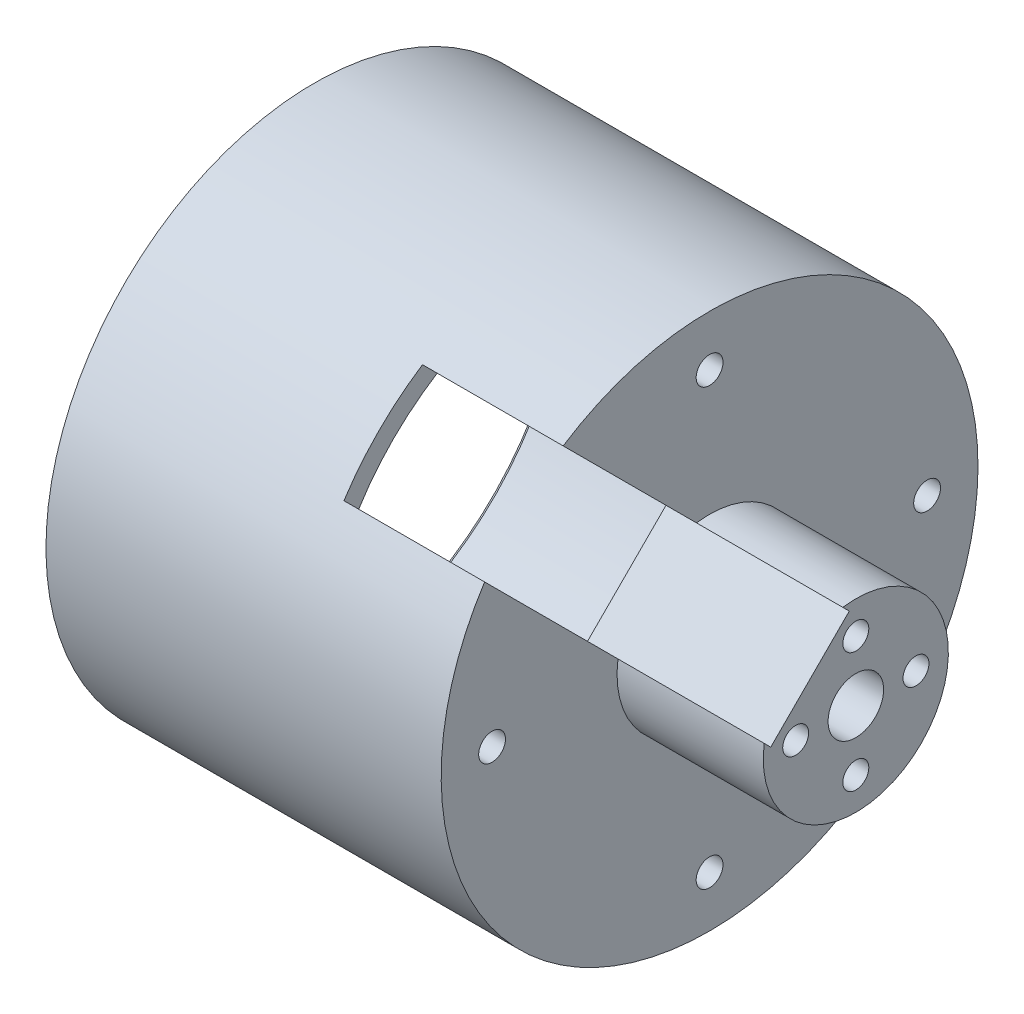
ISO-10303-21;
HEADER;
FILE_DESCRIPTION(('STEP AP214'),'2;1');
FILE_NAME('part.step','',(''),(''),'','','');
FILE_SCHEMA(('AUTOMOTIVE_DESIGN { 1 0 10303 214 1 1 1 1 }'));
ENDSEC;
DATA;
#1=APPLICATION_CONTEXT('core data for automotive mechanical design processes');
#2=APPLICATION_PROTOCOL_DEFINITION('international standard','automotive_design',2000,#1);
#3=PRODUCT_CONTEXT('',#1,'mechanical');
#4=PRODUCT('Part','Part','',(#3));
#5=PRODUCT_RELATED_PRODUCT_CATEGORY('part','',(#4));
#6=PRODUCT_DEFINITION_FORMATION('','',#4);
#7=PRODUCT_DEFINITION_CONTEXT('part definition',#1,'design');
#8=PRODUCT_DEFINITION('design','',#6,#7);
#9=PRODUCT_DEFINITION_SHAPE('','',#8);
#10=(LENGTH_UNIT() NAMED_UNIT(*) SI_UNIT(.MILLI.,.METRE.));
#11=(NAMED_UNIT(*) PLANE_ANGLE_UNIT() SI_UNIT($,.RADIAN.));
#12=(NAMED_UNIT(*) SI_UNIT($,.STERADIAN.) SOLID_ANGLE_UNIT());
#13=UNCERTAINTY_MEASURE_WITH_UNIT(LENGTH_MEASURE(1.E-05),#10,'distance_accuracy_value','');
#14=(GEOMETRIC_REPRESENTATION_CONTEXT(3) GLOBAL_UNCERTAINTY_ASSIGNED_CONTEXT((#13)) GLOBAL_UNIT_ASSIGNED_CONTEXT((#10,
#11,#12)) REPRESENTATION_CONTEXT('',''));
#15=CARTESIAN_POINT('',(0.,0.,0.));
#16=DIRECTION('',(0.,0.,1.));
#17=DIRECTION('',(1.,0.,0.));
#18=AXIS2_PLACEMENT_3D('',#15,#16,#17);
#19=CARTESIAN_POINT('',(21.2,0.,0.));
#20=DIRECTION('',(-1.,0.,0.));
#21=DIRECTION('',(0.,0.,1.));
#22=AXIS2_PLACEMENT_3D('',#19,#20,#21);
#23=CYLINDRICAL_SURFACE('',#22,29.);
#24=CARTESIAN_POINT('',(-21.5,0.,0.));
#25=DIRECTION('',(1.,0.,0.));
#26=DIRECTION('',(0.,0.,-1.));
#27=AXIS2_PLACEMENT_3D('',#24,#25,#26);
#28=CIRCLE('',#27,29.);
#29=CARTESIAN_POINT('',(-21.5,0.,-29.));
#30=VERTEX_POINT('',#29);
#31=EDGE_CURVE('E216',#30,#30,#28,.T.);
#32=ORIENTED_EDGE('',*,*,#31,.T.);
#33=EDGE_LOOP('',(#32));
#34=FACE_BOUND('',#33,.T.);
#35=DIRECTION('',(-1.,0.,0.));
#36=VECTOR('',#35,1.);
#37=CARTESIAN_POINT('',(21.2,15.8197619606196,24.3050433348582));
#38=LINE('',#37,#36);
#39=CARTESIAN_POINT('',(6.,15.8197619606196,24.3050433348582));
#40=VERTEX_POINT('',#39);
#41=CARTESIAN_POINT('',(21.2,15.8197619606196,24.3050433348582));
#42=VERTEX_POINT('',#41);
#43=EDGE_CURVE('E182',#40,#42,#38,.F.);
#44=ORIENTED_EDGE('',*,*,#43,.F.);
#45=CARTESIAN_POINT('',(6.,0.,0.));
#46=DIRECTION('',(1.,0.,0.));
#47=DIRECTION('',(0.,0.,-1.));
#48=AXIS2_PLACEMENT_3D('',#45,#46,#47);
#49=CIRCLE('',#48,29.);
#50=CARTESIAN_POINT('',(6.,24.3050433348582,15.8197619606196));
#51=VERTEX_POINT('',#50);
#52=EDGE_CURVE('E189',#51,#40,#49,.T.);
#53=ORIENTED_EDGE('',*,*,#52,.F.);
#54=DIRECTION('',(-1.,0.,0.));
#55=VECTOR('',#54,1.);
#56=CARTESIAN_POINT('',(21.2,24.3050433348582,15.8197619606196));
#57=LINE('',#56,#55);
#58=CARTESIAN_POINT('',(21.2,24.3050433348582,15.8197619606196));
#59=VERTEX_POINT('',#58);
#60=EDGE_CURVE('E171',#59,#51,#57,.T.);
#61=ORIENTED_EDGE('',*,*,#60,.F.);
#62=CARTESIAN_POINT('',(21.2,0.,0.));
#63=DIRECTION('',(1.,0.,0.));
#64=DIRECTION('',(0.,0.,-1.));
#65=AXIS2_PLACEMENT_3D('',#62,#63,#64);
#66=CIRCLE('',#65,29.);
#67=EDGE_CURVE('E110',#42,#59,#66,.T.);
#68=ORIENTED_EDGE('',*,*,#67,.F.);
#69=EDGE_LOOP('',(#44,#53,#61,#68));
#70=FACE_BOUND('',#69,.T.);
#71=ADVANCED_FACE('F41',(#34,#70),#23,.T.);
#72=CARTESIAN_POINT('',(21.2,0.,0.));
#73=DIRECTION('',(1.,0.,0.));
#74=DIRECTION('',(0.,0.,-1.));
#75=AXIS2_PLACEMENT_3D('',#72,#73,#74);
#76=PLANE('',#75);
#77=CARTESIAN_POINT('',(21.2,0.,-23.5));
#78=DIRECTION('',(1.,0.,0.));
#79=DIRECTION('',(0.,0.,-1.));
#80=AXIS2_PLACEMENT_3D('',#77,#78,#79);
#81=CIRCLE('',#80,1.45);
#82=CARTESIAN_POINT('',(21.2,0.,-24.95));
#83=VERTEX_POINT('',#82);
#84=EDGE_CURVE('E192',#83,#83,#81,.F.);
#85=ORIENTED_EDGE('',*,*,#84,.T.);
#86=EDGE_LOOP('',(#85));
#87=FACE_BOUND('',#86,.T.);
#88=CARTESIAN_POINT('',(21.2,-23.5,0.));
#89=DIRECTION('',(1.,0.,0.));
#90=DIRECTION('',(0.,0.,-1.));
#91=AXIS2_PLACEMENT_3D('',#88,#89,#90);
#92=CIRCLE('',#91,1.45);
#93=CARTESIAN_POINT('',(21.2,-23.5,-1.45));
#94=VERTEX_POINT('',#93);
#95=EDGE_CURVE('E196',#94,#94,#92,.F.);
#96=ORIENTED_EDGE('',*,*,#95,.T.);
#97=EDGE_LOOP('',(#96));
#98=FACE_BOUND('',#97,.T.);
#99=CARTESIAN_POINT('',(21.2,0.,23.5));
#100=DIRECTION('',(1.,0.,0.));
#101=DIRECTION('',(0.,0.,-1.));
#102=AXIS2_PLACEMENT_3D('',#99,#100,#101);
#103=CIRCLE('',#102,1.45);
#104=CARTESIAN_POINT('',(21.2,0.,22.05));
#105=VERTEX_POINT('',#104);
#106=EDGE_CURVE('E200',#105,#105,#103,.F.);
#107=ORIENTED_EDGE('',*,*,#106,.T.);
#108=EDGE_LOOP('',(#107));
#109=FACE_BOUND('',#108,.T.);
#110=CARTESIAN_POINT('',(21.2,23.5,0.));
#111=DIRECTION('',(1.,0.,0.));
#112=DIRECTION('',(0.,0.,-1.));
#113=AXIS2_PLACEMENT_3D('',#110,#111,#112);
#114=CIRCLE('',#113,1.45);
#115=CARTESIAN_POINT('',(21.2,23.5,-1.45));
#116=VERTEX_POINT('',#115);
#117=EDGE_CURVE('E204',#116,#116,#114,.F.);
#118=ORIENTED_EDGE('',*,*,#117,.T.);
#119=EDGE_LOOP('',(#118));
#120=FACE_BOUND('',#119,.T.);
#121=CARTESIAN_POINT('',(21.2,0.,0.));
#122=DIRECTION('',(1.,0.,0.));
#123=DIRECTION('',(0.,0.,-1.));
#124=AXIS2_PLACEMENT_3D('',#121,#122,#123);
#125=CIRCLE('',#124,10.);
#126=CARTESIAN_POINT('',(21.2,9.89949493661167,1.41421356237309));
#127=VERTEX_POINT('',#126);
#128=CARTESIAN_POINT('',(21.2,1.41421356237309,9.89949493661166));
#129=VERTEX_POINT('',#128);
#130=EDGE_CURVE('E212',#127,#129,#125,.F.);
#131=ORIENTED_EDGE('',*,*,#130,.T.);
#132=DIRECTION('',(0.,0.707106781186548,0.707106781186547));
#133=VECTOR('',#132,1.);
#134=CARTESIAN_POINT('',(21.2,-4.24264068711928,4.24264068711929));
#135=LINE('',#134,#133);
#136=EDGE_CURVE('E179',#129,#42,#135,.T.);
#137=ORIENTED_EDGE('',*,*,#136,.T.);
#138=ORIENTED_EDGE('',*,*,#67,.T.);
#139=DIRECTION('',(0.,-0.707106781186548,-0.707106781186547));
#140=VECTOR('',#139,1.);
#141=CARTESIAN_POINT('',(21.2,4.24264068711929,-4.24264068711929));
#142=LINE('',#141,#140);
#143=EDGE_CURVE('E168',#59,#127,#142,.T.);
#144=ORIENTED_EDGE('',*,*,#143,.T.);
#145=EDGE_LOOP('',(#131,#137,#138,#144));
#146=FACE_BOUND('',#145,.T.);
#147=ADVANCED_FACE('F257',(#87,#98,#109,#120,#146),#76,.T.);
#148=CARTESIAN_POINT('',(17.2,0.,0.));
#149=DIRECTION('',(-1.,0.,0.));
#150=DIRECTION('',(0.,0.,1.));
#151=AXIS2_PLACEMENT_3D('',#148,#149,#150);
#152=CYLINDRICAL_SURFACE('',#151,26.8);
#153=CARTESIAN_POINT('',(-21.,0.,0.));
#154=DIRECTION('',(1.,0.,0.));
#155=DIRECTION('',(0.,1.,0.));
#156=AXIS2_PLACEMENT_3D('',#153,#154,#155);
#157=CIRCLE('',#156,26.8);
#158=CARTESIAN_POINT('',(-21.,26.8,0.));
#159=VERTEX_POINT('',#158);
#160=EDGE_CURVE('E151',#159,#159,#157,.T.);
#161=ORIENTED_EDGE('',*,*,#160,.F.);
#162=EDGE_LOOP('',(#161));
#163=FACE_BOUND('',#162,.T.);
#164=CARTESIAN_POINT('',(6.,0.,0.));
#165=DIRECTION('',(1.,0.,0.));
#166=DIRECTION('',(0.,0.,-1.));
#167=AXIS2_PLACEMENT_3D('',#164,#165,#166);
#168=CIRCLE('',#167,26.8);
#169=CARTESIAN_POINT('',(6.,22.7120748961036,14.226793521865));
#170=VERTEX_POINT('',#169);
#171=CARTESIAN_POINT('',(6.,14.226793521865,22.7120748961036));
#172=VERTEX_POINT('',#171);
#173=EDGE_CURVE('E11',#170,#172,#168,.T.);
#174=ORIENTED_EDGE('',*,*,#173,.T.);
#175=DIRECTION('',(-1.,0.,0.));
#176=VECTOR('',#175,1.);
#177=CARTESIAN_POINT('',(17.2,14.226793521865,22.7120748961036));
#178=LINE('',#177,#176);
#179=CARTESIAN_POINT('',(17.2,14.226793521865,22.7120748961036));
#180=VERTEX_POINT('',#179);
#181=EDGE_CURVE('E186',#172,#180,#178,.F.);
#182=ORIENTED_EDGE('',*,*,#181,.T.);
#183=CARTESIAN_POINT('',(17.2,0.,0.));
#184=DIRECTION('',(1.,0.,0.));
#185=DIRECTION('',(0.,0.,-1.));
#186=AXIS2_PLACEMENT_3D('',#183,#184,#185);
#187=CIRCLE('',#186,26.8);
#188=CARTESIAN_POINT('',(17.2,22.7120748961036,14.226793521865));
#189=VERTEX_POINT('',#188);
#190=EDGE_CURVE('E213',#180,#189,#187,.T.);
#191=ORIENTED_EDGE('',*,*,#190,.T.);
#192=DIRECTION('',(-1.,0.,0.));
#193=VECTOR('',#192,1.);
#194=CARTESIAN_POINT('',(17.2,22.7120748961036,14.226793521865));
#195=LINE('',#194,#193);
#196=EDGE_CURVE('E174',#189,#170,#195,.T.);
#197=ORIENTED_EDGE('',*,*,#196,.T.);
#198=EDGE_LOOP('',(#174,#182,#191,#197));
#199=FACE_BOUND('',#198,.T.);
#200=ADVANCED_FACE('F239',(#163,#199),#152,.F.);
#201=CARTESIAN_POINT('',(17.2,0.,0.));
#202=DIRECTION('',(1.,0.,0.));
#203=DIRECTION('',(0.,0.,-1.));
#204=AXIS2_PLACEMENT_3D('',#201,#202,#203);
#205=PLANE('',#204);
#206=CARTESIAN_POINT('',(17.2,0.,0.));
#207=DIRECTION('',(1.,0.,0.));
#208=DIRECTION('',(0.,0.,-1.));
#209=AXIS2_PLACEMENT_3D('',#206,#207,#208);
#210=CIRCLE('',#209,3.);
#211=CARTESIAN_POINT('',(17.2,0.,-3.));
#212=VERTEX_POINT('',#211);
#213=EDGE_CURVE('E208',#212,#212,#210,.F.);
#214=ORIENTED_EDGE('',*,*,#213,.F.);
#215=EDGE_LOOP('',(#214));
#216=FACE_BOUND('',#215,.T.);
#217=CARTESIAN_POINT('',(17.2,23.5,0.));
#218=DIRECTION('',(1.,0.,0.));
#219=DIRECTION('',(0.,0.,-1.));
#220=AXIS2_PLACEMENT_3D('',#217,#218,#219);
#221=CIRCLE('',#220,1.45);
#222=CARTESIAN_POINT('',(17.2,23.5,-1.45));
#223=VERTEX_POINT('',#222);
#224=EDGE_CURVE('E203',#223,#223,#221,.F.);
#225=ORIENTED_EDGE('',*,*,#224,.F.);
#226=EDGE_LOOP('',(#225));
#227=FACE_BOUND('',#226,.T.);
#228=CARTESIAN_POINT('',(17.2,0.,23.5));
#229=DIRECTION('',(1.,0.,0.));
#230=DIRECTION('',(0.,0.,-1.));
#231=AXIS2_PLACEMENT_3D('',#228,#229,#230);
#232=CIRCLE('',#231,1.45);
#233=CARTESIAN_POINT('',(17.2,0.,22.05));
#234=VERTEX_POINT('',#233);
#235=EDGE_CURVE('E199',#234,#234,#232,.F.);
#236=ORIENTED_EDGE('',*,*,#235,.F.);
#237=EDGE_LOOP('',(#236));
#238=FACE_BOUND('',#237,.T.);
#239=CARTESIAN_POINT('',(17.2,-23.5,0.));
#240=DIRECTION('',(1.,0.,0.));
#241=DIRECTION('',(0.,0.,-1.));
#242=AXIS2_PLACEMENT_3D('',#239,#240,#241);
#243=CIRCLE('',#242,1.45);
#244=CARTESIAN_POINT('',(17.2,-23.5,-1.45));
#245=VERTEX_POINT('',#244);
#246=EDGE_CURVE('E195',#245,#245,#243,.F.);
#247=ORIENTED_EDGE('',*,*,#246,.F.);
#248=EDGE_LOOP('',(#247));
#249=FACE_BOUND('',#248,.T.);
#250=CARTESIAN_POINT('',(17.2,0.,-23.5));
#251=DIRECTION('',(1.,0.,0.));
#252=DIRECTION('',(0.,0.,-1.));
#253=AXIS2_PLACEMENT_3D('',#250,#251,#252);
#254=CIRCLE('',#253,1.45);
#255=CARTESIAN_POINT('',(17.2,0.,-24.95));
#256=VERTEX_POINT('',#255);
#257=EDGE_CURVE('E191',#256,#256,#254,.F.);
#258=ORIENTED_EDGE('',*,*,#257,.F.);
#259=EDGE_LOOP('',(#258));
#260=FACE_BOUND('',#259,.T.);
#261=DIRECTION('',(0.,0.707106781186548,0.707106781186547));
#262=VECTOR('',#261,1.);
#263=CARTESIAN_POINT('',(17.2,-4.24264068711928,4.24264068711929));
#264=LINE('',#263,#262);
#265=CARTESIAN_POINT('',(17.2,0.707106781186548,9.19238815542512));
#266=VERTEX_POINT('',#265);
#267=EDGE_CURVE('E184',#266,#180,#264,.T.);
#268=ORIENTED_EDGE('',*,*,#267,.F.);
#269=DIRECTION('',(0.,-0.707106781186547,0.707106781186548));
#270=VECTOR('',#269,1.);
#271=CARTESIAN_POINT('',(17.2,4.94974746830583,4.94974746830583));
#272=LINE('',#271,#270);
#273=CARTESIAN_POINT('',(17.2,9.19238815542512,0.707106781186548));
#274=VERTEX_POINT('',#273);
#275=EDGE_CURVE('E164',#274,#266,#272,.T.);
#276=ORIENTED_EDGE('',*,*,#275,.F.);
#277=DIRECTION('',(0.,-0.707106781186548,-0.707106781186547));
#278=VECTOR('',#277,1.);
#279=CARTESIAN_POINT('',(17.2,4.24264068711929,-4.24264068711929));
#280=LINE('',#279,#278);
#281=EDGE_CURVE('E116',#189,#274,#280,.T.);
#282=ORIENTED_EDGE('',*,*,#281,.F.);
#283=ORIENTED_EDGE('',*,*,#190,.F.);
#284=EDGE_LOOP('',(#268,#276,#282,#283));
#285=FACE_BOUND('',#284,.T.);
#286=ADVANCED_FACE('F235',(#216,#227,#238,#249,#260,#285),#205,.F.);
#287=CARTESIAN_POINT('',(37.,0.,0.));
#288=DIRECTION('',(-1.,0.,0.));
#289=DIRECTION('',(0.,0.,1.));
#290=AXIS2_PLACEMENT_3D('',#287,#288,#289);
#291=CYLINDRICAL_SURFACE('',#290,10.);
#292=DIRECTION('',(-1.,0.,0.));
#293=VECTOR('',#292,1.);
#294=CARTESIAN_POINT('',(37.,1.41421356237309,9.89949493661167));
#295=LINE('',#294,#293);
#296=CARTESIAN_POINT('',(37.,1.41421356237309,9.89949493661167));
#297=VERTEX_POINT('',#296);
#298=EDGE_CURVE('E177',#129,#297,#295,.F.);
#299=ORIENTED_EDGE('',*,*,#298,.F.);
#300=ORIENTED_EDGE('',*,*,#130,.F.);
#301=DIRECTION('',(-1.,0.,0.));
#302=VECTOR('',#301,1.);
#303=CARTESIAN_POINT('',(37.,9.89949493661167,1.4142135623731));
#304=LINE('',#303,#302);
#305=CARTESIAN_POINT('',(37.,9.89949493661167,1.41421356237309));
#306=VERTEX_POINT('',#305);
#307=EDGE_CURVE('E166',#306,#127,#304,.T.);
#308=ORIENTED_EDGE('',*,*,#307,.F.);
#309=CARTESIAN_POINT('',(37.,0.,0.));
#310=DIRECTION('',(1.,0.,0.));
#311=DIRECTION('',(0.,0.,-1.));
#312=AXIS2_PLACEMENT_3D('',#309,#310,#311);
#313=CIRCLE('',#312,10.);
#314=EDGE_CURVE('E123',#297,#306,#313,.T.);
#315=ORIENTED_EDGE('',*,*,#314,.F.);
#316=EDGE_LOOP('',(#299,#300,#308,#315));
#317=FACE_BOUND('',#316,.T.);
#318=ADVANCED_FACE('F238',(#317),#291,.T.);
#319=CARTESIAN_POINT('',(37.,0.,0.));
#320=DIRECTION('',(1.,0.,0.));
#321=DIRECTION('',(0.,0.,-1.));
#322=AXIS2_PLACEMENT_3D('',#319,#320,#321);
#323=PLANE('',#322);
#324=CARTESIAN_POINT('',(37.,0.,-6.5));
#325=DIRECTION('',(1.,0.,0.));
#326=DIRECTION('',(0.,0.,-1.));
#327=AXIS2_PLACEMENT_3D('',#324,#325,#326);
#328=CIRCLE('',#327,1.4);
#329=CARTESIAN_POINT('',(37.,0.,-5.1));
#330=VERTEX_POINT('',#329);
#331=EDGE_CURVE('E139',#330,#330,#328,.F.);
#332=ORIENTED_EDGE('',*,*,#331,.T.);
#333=EDGE_LOOP('',(#332));
#334=FACE_BOUND('',#333,.T.);
#335=CARTESIAN_POINT('',(37.,-6.5,0.));
#336=DIRECTION('',(1.,0.,0.));
#337=DIRECTION('',(0.,0.,-1.));
#338=AXIS2_PLACEMENT_3D('',#335,#336,#337);
#339=CIRCLE('',#338,1.4);
#340=CARTESIAN_POINT('',(37.,-6.5,1.4));
#341=VERTEX_POINT('',#340);
#342=EDGE_CURVE('E136',#341,#341,#339,.F.);
#343=ORIENTED_EDGE('',*,*,#342,.T.);
#344=EDGE_LOOP('',(#343));
#345=FACE_BOUND('',#344,.T.);
#346=CARTESIAN_POINT('',(37.,0.,6.5));
#347=DIRECTION('',(1.,0.,0.));
#348=DIRECTION('',(0.,0.,-1.));
#349=AXIS2_PLACEMENT_3D('',#346,#347,#348);
#350=CIRCLE('',#349,1.4);
#351=CARTESIAN_POINT('',(37.,0.,7.9));
#352=VERTEX_POINT('',#351);
#353=EDGE_CURVE('E132',#352,#352,#350,.F.);
#354=ORIENTED_EDGE('',*,*,#353,.T.);
#355=EDGE_LOOP('',(#354));
#356=FACE_BOUND('',#355,.T.);
#357=CARTESIAN_POINT('',(37.,6.50000000000001,0.));
#358=DIRECTION('',(1.,0.,0.));
#359=DIRECTION('',(0.,0.,-1.));
#360=AXIS2_PLACEMENT_3D('',#357,#358,#359);
#361=CIRCLE('',#360,1.4);
#362=CARTESIAN_POINT('',(37.,6.50000000000001,1.4));
#363=VERTEX_POINT('',#362);
#364=EDGE_CURVE('E128',#363,#363,#361,.F.);
#365=ORIENTED_EDGE('',*,*,#364,.T.);
#366=EDGE_LOOP('',(#365));
#367=FACE_BOUND('',#366,.T.);
#368=CARTESIAN_POINT('',(37.,0.,0.));
#369=DIRECTION('',(1.,0.,0.));
#370=DIRECTION('',(0.,0.,-1.));
#371=AXIS2_PLACEMENT_3D('',#368,#369,#370);
#372=CIRCLE('',#371,3.);
#373=CARTESIAN_POINT('',(37.,0.,-3.));
#374=VERTEX_POINT('',#373);
#375=EDGE_CURVE('E207',#374,#374,#372,.F.);
#376=ORIENTED_EDGE('',*,*,#375,.T.);
#377=EDGE_LOOP('',(#376));
#378=FACE_BOUND('',#377,.T.);
#379=DIRECTION('',(0.,-0.707106781186547,0.707106781186548));
#380=VECTOR('',#379,1.);
#381=CARTESIAN_POINT('',(37.,4.94974746830583,4.94974746830583));
#382=LINE('',#381,#380);
#383=CARTESIAN_POINT('',(37.,9.19238815542512,0.707106781186547));
#384=VERTEX_POINT('',#383);
#385=CARTESIAN_POINT('',(37.,0.707106781186548,9.19238815542512));
#386=VERTEX_POINT('',#385);
#387=EDGE_CURVE('E104',#384,#386,#382,.T.);
#388=ORIENTED_EDGE('',*,*,#387,.T.);
#389=DIRECTION('',(0.,0.707106781186548,0.707106781186547));
#390=VECTOR('',#389,1.);
#391=CARTESIAN_POINT('',(37.,-4.24264068711929,4.24264068711929));
#392=LINE('',#391,#390);
#393=EDGE_CURVE('E49',#386,#297,#392,.T.);
#394=ORIENTED_EDGE('',*,*,#393,.T.);
#395=ORIENTED_EDGE('',*,*,#314,.T.);
#396=DIRECTION('',(0.,-0.707106781186548,-0.707106781186547));
#397=VECTOR('',#396,1.);
#398=CARTESIAN_POINT('',(37.,4.24264068711929,-4.24264068711929));
#399=LINE('',#398,#397);
#400=EDGE_CURVE('E109',#306,#384,#399,.T.);
#401=ORIENTED_EDGE('',*,*,#400,.T.);
#402=EDGE_LOOP('',(#388,#394,#395,#401));
#403=FACE_BOUND('',#402,.T.);
#404=ADVANCED_FACE('F121',(#334,#345,#356,#367,#378,#403),#323,.T.);
#405=CARTESIAN_POINT('',(-21.5,0.,0.));
#406=DIRECTION('',(1.,0.,0.));
#407=DIRECTION('',(0.,0.,-1.));
#408=AXIS2_PLACEMENT_3D('',#405,#406,#407);
#409=PLANE('',#408);
#410=CARTESIAN_POINT('',(-21.5,0.,0.));
#411=DIRECTION('',(1.,0.,0.));
#412=DIRECTION('',(0.,0.,-1.));
#413=AXIS2_PLACEMENT_3D('',#410,#411,#412);
#414=CIRCLE('',#413,27.2901960784314);
#415=CARTESIAN_POINT('',(-21.5,0.,-27.2901960784314));
#416=VERTEX_POINT('',#415);
#417=EDGE_CURVE('E44',#416,#416,#414,.T.);
#418=ORIENTED_EDGE('',*,*,#417,.T.);
#419=EDGE_LOOP('',(#418));
#420=FACE_BOUND('',#419,.T.);
#421=ORIENTED_EDGE('',*,*,#31,.F.);
#422=EDGE_LOOP('',(#421));
#423=FACE_BOUND('',#422,.T.);
#424=ADVANCED_FACE('F266',(#420,#423),#409,.F.);
#425=CARTESIAN_POINT('',(38.,0.,0.));
#426=DIRECTION('',(-1.,0.,0.));
#427=DIRECTION('',(0.,0.,1.));
#428=AXIS2_PLACEMENT_3D('',#425,#426,#427);
#429=CYLINDRICAL_SURFACE('',#428,3.);
#430=ORIENTED_EDGE('',*,*,#375,.F.);
#431=EDGE_LOOP('',(#430));
#432=FACE_BOUND('',#431,.T.);
#433=ORIENTED_EDGE('',*,*,#213,.T.);
#434=EDGE_LOOP('',(#433));
#435=FACE_BOUND('',#434,.T.);
#436=ADVANCED_FACE('F278',(#432,#435),#429,.F.);
#437=CARTESIAN_POINT('',(21.3,23.5,0.));
#438=DIRECTION('',(-1.,0.,0.));
#439=DIRECTION('',(0.,0.,1.));
#440=AXIS2_PLACEMENT_3D('',#437,#438,#439);
#441=CYLINDRICAL_SURFACE('',#440,1.45);
#442=ORIENTED_EDGE('',*,*,#117,.F.);
#443=EDGE_LOOP('',(#442));
#444=FACE_BOUND('',#443,.T.);
#445=ORIENTED_EDGE('',*,*,#224,.T.);
#446=EDGE_LOOP('',(#445));
#447=FACE_BOUND('',#446,.T.);
#448=ADVANCED_FACE('F283',(#444,#447),#441,.F.);
#449=CARTESIAN_POINT('',(21.3,0.,23.5));
#450=DIRECTION('',(-1.,0.,0.));
#451=DIRECTION('',(0.,0.,1.));
#452=AXIS2_PLACEMENT_3D('',#449,#450,#451);
#453=CYLINDRICAL_SURFACE('',#452,1.45);
#454=ORIENTED_EDGE('',*,*,#106,.F.);
#455=EDGE_LOOP('',(#454));
#456=FACE_BOUND('',#455,.T.);
#457=ORIENTED_EDGE('',*,*,#235,.T.);
#458=EDGE_LOOP('',(#457));
#459=FACE_BOUND('',#458,.T.);
#460=ADVANCED_FACE('F347',(#456,#459),#453,.F.);
#461=CARTESIAN_POINT('',(21.3,-23.5,0.));
#462=DIRECTION('',(-1.,0.,0.));
#463=DIRECTION('',(0.,0.,1.));
#464=AXIS2_PLACEMENT_3D('',#461,#462,#463);
#465=CYLINDRICAL_SURFACE('',#464,1.45);
#466=ORIENTED_EDGE('',*,*,#95,.F.);
#467=EDGE_LOOP('',(#466));
#468=FACE_BOUND('',#467,.T.);
#469=ORIENTED_EDGE('',*,*,#246,.T.);
#470=EDGE_LOOP('',(#469));
#471=FACE_BOUND('',#470,.T.);
#472=ADVANCED_FACE('F343',(#468,#471),#465,.F.);
#473=CARTESIAN_POINT('',(21.3,0.,-23.5));
#474=DIRECTION('',(-1.,0.,0.));
#475=DIRECTION('',(0.,0.,1.));
#476=AXIS2_PLACEMENT_3D('',#473,#474,#475);
#477=CYLINDRICAL_SURFACE('',#476,1.45);
#478=ORIENTED_EDGE('',*,*,#84,.F.);
#479=EDGE_LOOP('',(#478));
#480=FACE_BOUND('',#479,.T.);
#481=ORIENTED_EDGE('',*,*,#257,.T.);
#482=EDGE_LOOP('',(#481));
#483=FACE_BOUND('',#482,.T.);
#484=ADVANCED_FACE('F233',(#480,#483),#477,.F.);
#485=CARTESIAN_POINT('',(6.,28.9913780286485,20.5060966544099));
#486=DIRECTION('',(1.,0.,0.));
#487=DIRECTION('',(0.,-0.707106781186548,-0.707106781186547));
#488=AXIS2_PLACEMENT_3D('',#485,#486,#487);
#489=PLANE('',#488);
#490=ORIENTED_EDGE('',*,*,#52,.T.);
#491=DIRECTION('',(0.,-0.707106781186548,-0.707106781186547));
#492=VECTOR('',#491,1.);
#493=CARTESIAN_POINT('',(6.,20.5060966544099,28.9913780286484));
#494=LINE('',#493,#492);
#495=EDGE_CURVE('E161',#40,#172,#494,.T.);
#496=ORIENTED_EDGE('',*,*,#495,.T.);
#497=ORIENTED_EDGE('',*,*,#173,.F.);
#498=DIRECTION('',(0.,-0.707106781186548,-0.707106781186547));
#499=VECTOR('',#498,1.);
#500=CARTESIAN_POINT('',(6.,28.9913780286485,20.5060966544099));
#501=LINE('',#500,#499);
#502=EDGE_CURVE('E118',#51,#170,#501,.T.);
#503=ORIENTED_EDGE('',*,*,#502,.F.);
#504=EDGE_LOOP('',(#490,#496,#497,#503));
#505=FACE_BOUND('',#504,.T.);
#506=ADVANCED_FACE('F250',(#505),#489,.T.);
#507=CARTESIAN_POINT('',(6.,20.5060966544099,28.9913780286484));
#508=DIRECTION('',(0.,0.707106781186547,-0.707106781186547));
#509=DIRECTION('',(0.,0.707106781186548,0.707106781186547));
#510=AXIS2_PLACEMENT_3D('',#507,#508,#509);
#511=PLANE('',#510);
#512=ORIENTED_EDGE('',*,*,#495,.F.);
#513=ORIENTED_EDGE('',*,*,#43,.T.);
#514=ORIENTED_EDGE('',*,*,#136,.F.);
#515=ORIENTED_EDGE('',*,*,#298,.T.);
#516=ORIENTED_EDGE('',*,*,#393,.F.);
#517=DIRECTION('',(1.,0.,0.));
#518=VECTOR('',#517,1.);
#519=CARTESIAN_POINT('',(6.,0.707106781186548,9.19238815542512));
#520=LINE('',#519,#518);
#521=EDGE_CURVE('E62',#266,#386,#520,.T.);
#522=ORIENTED_EDGE('',*,*,#521,.F.);
#523=ORIENTED_EDGE('',*,*,#267,.T.);
#524=ORIENTED_EDGE('',*,*,#181,.F.);
#525=EDGE_LOOP('',(#512,#513,#514,#515,#516,#522,#523,#524));
#526=FACE_BOUND('',#525,.T.);
#527=ADVANCED_FACE('F246',(#526),#511,.T.);
#528=CARTESIAN_POINT('',(37.1,28.9913780286485,20.5060966544099));
#529=DIRECTION('',(0.,-0.707106781186547,0.707106781186547));
#530=DIRECTION('',(0.,-0.707106781186548,-0.707106781186547));
#531=AXIS2_PLACEMENT_3D('',#528,#529,#530);
#532=PLANE('',#531);
#533=ORIENTED_EDGE('',*,*,#281,.T.);
#534=DIRECTION('',(-1.,0.,0.));
#535=VECTOR('',#534,1.);
#536=CARTESIAN_POINT('',(37.1,9.19238815542512,0.707106781186547));
#537=LINE('',#536,#535);
#538=EDGE_CURVE('E57',#384,#274,#537,.T.);
#539=ORIENTED_EDGE('',*,*,#538,.F.);
#540=ORIENTED_EDGE('',*,*,#400,.F.);
#541=ORIENTED_EDGE('',*,*,#307,.T.);
#542=ORIENTED_EDGE('',*,*,#143,.F.);
#543=ORIENTED_EDGE('',*,*,#60,.T.);
#544=ORIENTED_EDGE('',*,*,#502,.T.);
#545=ORIENTED_EDGE('',*,*,#196,.F.);
#546=EDGE_LOOP('',(#533,#539,#540,#541,#542,#543,#544,#545));
#547=FACE_BOUND('',#546,.T.);
#548=ADVANCED_FACE('F113',(#547),#532,.T.);
#549=CARTESIAN_POINT('',(6.,0.707106781186548,9.19238815542512));
#550=DIRECTION('',(0.,0.707106781186548,0.707106781186547));
#551=DIRECTION('',(1.,0.,0.));
#552=AXIS2_PLACEMENT_3D('',#549,#550,#551);
#553=PLANE('',#552);
#554=ORIENTED_EDGE('',*,*,#275,.T.);
#555=ORIENTED_EDGE('',*,*,#521,.T.);
#556=ORIENTED_EDGE('',*,*,#387,.F.);
#557=ORIENTED_EDGE('',*,*,#538,.T.);
#558=EDGE_LOOP('',(#554,#555,#556,#557));
#559=FACE_BOUND('',#558,.T.);
#560=ADVANCED_FACE('F105',(#559),#553,.T.);
#561=CARTESIAN_POINT('',(37.01,6.50000000000001,0.));
#562=DIRECTION('',(-1.,0.,0.));
#563=DIRECTION('',(0.,0.,1.));
#564=AXIS2_PLACEMENT_3D('',#561,#562,#563);
#565=CYLINDRICAL_SURFACE('',#564,1.4);
#566=CARTESIAN_POINT('',(24.99,6.50000000000001,0.));
#567=DIRECTION('',(1.,0.,0.));
#568=DIRECTION('',(0.,0.,-1.));
#569=AXIS2_PLACEMENT_3D('',#566,#567,#568);
#570=CIRCLE('',#569,1.4);
#571=CARTESIAN_POINT('',(24.99,6.50000000000001,1.4));
#572=VERTEX_POINT('',#571);
#573=EDGE_CURVE('E131',#572,#572,#570,.T.);
#574=CARTESIAN_POINT('',(37.,6.50000000000001,1.4));
#575=CARTESIAN_POINT('',(36.8748958333333,6.50000000000001,1.4));
#576=CARTESIAN_POINT('',(36.7497916666667,6.50000000000001,1.4));
#577=CARTESIAN_POINT('',(36.4995833333333,6.50000000000001,1.4));
#578=CARTESIAN_POINT('',(36.3744791666667,6.50000000000001,1.4));
#579=CARTESIAN_POINT('',(36.1242708333333,6.50000000000001,1.4));
#580=CARTESIAN_POINT('',(35.9991666666667,6.50000000000001,1.4));
#581=CARTESIAN_POINT('',(35.7489583333333,6.50000000000001,1.4));
#582=CARTESIAN_POINT('',(35.6238541666667,6.50000000000001,1.4));
#583=CARTESIAN_POINT('',(35.3736458333333,6.50000000000001,1.4));
#584=CARTESIAN_POINT('',(35.2485416666667,6.50000000000001,1.4));
#585=CARTESIAN_POINT('',(34.9983333333333,6.50000000000001,1.4));
#586=CARTESIAN_POINT('',(34.8732291666667,6.50000000000001,1.4));
#587=CARTESIAN_POINT('',(34.6230208333333,6.50000000000001,1.4));
#588=CARTESIAN_POINT('',(34.4979166666667,6.50000000000001,1.4));
#589=CARTESIAN_POINT('',(34.2477083333333,6.50000000000001,1.4));
#590=CARTESIAN_POINT('',(34.1226041666667,6.50000000000001,1.4));
#591=CARTESIAN_POINT('',(33.8723958333333,6.50000000000001,1.4));
#592=CARTESIAN_POINT('',(33.7472916666667,6.50000000000001,1.4));
#593=CARTESIAN_POINT('',(33.4970833333333,6.50000000000001,1.4));
#594=CARTESIAN_POINT('',(33.3719791666667,6.50000000000001,1.4));
#595=CARTESIAN_POINT('',(33.1217708333333,6.50000000000001,1.4));
#596=CARTESIAN_POINT('',(32.9966666666667,6.50000000000001,1.4));
#597=CARTESIAN_POINT('',(32.7464583333333,6.50000000000001,1.4));
#598=CARTESIAN_POINT('',(32.6213541666667,6.50000000000001,1.4));
#599=CARTESIAN_POINT('',(32.3711458333333,6.50000000000001,1.4));
#600=CARTESIAN_POINT('',(32.2460416666667,6.50000000000001,1.4));
#601=CARTESIAN_POINT('',(31.9958333333333,6.50000000000001,1.4));
#602=CARTESIAN_POINT('',(31.8707291666667,6.50000000000001,1.4));
#603=CARTESIAN_POINT('',(31.6205208333333,6.50000000000001,1.4));
#604=CARTESIAN_POINT('',(31.4954166666667,6.50000000000001,1.4));
#605=CARTESIAN_POINT('',(31.2452083333333,6.50000000000001,1.4));
#606=CARTESIAN_POINT('',(31.1201041666667,6.50000000000001,1.4));
#607=CARTESIAN_POINT('',(30.8698958333333,6.50000000000001,1.4));
#608=CARTESIAN_POINT('',(30.7447916666667,6.50000000000001,1.4));
#609=CARTESIAN_POINT('',(30.4945833333333,6.50000000000001,1.4));
#610=CARTESIAN_POINT('',(30.3694791666667,6.50000000000001,1.4));
#611=CARTESIAN_POINT('',(30.1192708333333,6.50000000000001,1.4));
#612=CARTESIAN_POINT('',(29.9941666666667,6.50000000000001,1.4));
#613=CARTESIAN_POINT('',(29.7439583333333,6.50000000000001,1.4));
#614=CARTESIAN_POINT('',(29.6188541666667,6.50000000000001,1.4));
#615=CARTESIAN_POINT('',(29.3686458333333,6.50000000000001,1.4));
#616=CARTESIAN_POINT('',(29.2435416666667,6.50000000000001,1.4));
#617=CARTESIAN_POINT('',(28.9933333333333,6.50000000000001,1.4));
#618=CARTESIAN_POINT('',(28.8682291666667,6.50000000000001,1.4));
#619=CARTESIAN_POINT('',(28.6180208333333,6.50000000000001,1.4));
#620=CARTESIAN_POINT('',(28.4929166666667,6.50000000000001,1.4));
#621=CARTESIAN_POINT('',(28.2427083333333,6.50000000000001,1.4));
#622=CARTESIAN_POINT('',(28.1176041666667,6.50000000000001,1.4));
#623=CARTESIAN_POINT('',(27.8673958333333,6.50000000000001,1.4));
#624=CARTESIAN_POINT('',(27.7422916666667,6.50000000000001,1.4));
#625=CARTESIAN_POINT('',(27.4920833333333,6.50000000000001,1.4));
#626=CARTESIAN_POINT('',(27.3669791666667,6.50000000000001,1.4));
#627=CARTESIAN_POINT('',(27.1167708333333,6.50000000000001,1.4));
#628=CARTESIAN_POINT('',(26.9916666666667,6.50000000000001,1.4));
#629=CARTESIAN_POINT('',(26.7414583333333,6.50000000000001,1.4));
#630=CARTESIAN_POINT('',(26.6163541666667,6.50000000000001,1.4));
#631=CARTESIAN_POINT('',(26.3661458333333,6.50000000000001,1.4));
#632=CARTESIAN_POINT('',(26.2410416666667,6.50000000000001,1.4));
#633=CARTESIAN_POINT('',(25.9908333333333,6.50000000000001,1.4));
#634=CARTESIAN_POINT('',(25.8657291666667,6.50000000000001,1.4));
#635=CARTESIAN_POINT('',(25.6155208333333,6.50000000000001,1.4));
#636=CARTESIAN_POINT('',(25.4904166666667,6.50000000000001,1.4));
#637=CARTESIAN_POINT('',(25.2402083333333,6.50000000000001,1.4));
#638=CARTESIAN_POINT('',(25.1151041666667,6.50000000000001,1.4));
#639=CARTESIAN_POINT('',(24.99,6.50000000000001,1.4));
#640=B_SPLINE_CURVE_WITH_KNOTS('',3,(#574,#575,#576,#577,#578,#579,#580,#581,#582,#583,#584,
#585,#586,#587,#588,#589,#590,#591,#592,#593,#594,#595,#596,#597,#598,#599,#600,#601,#602,#603,
#604,#605,#606,#607,#608,#609,#610,#611,#612,#613,#614,#615,#616,#617,#618,#619,#620,#621,#622,
#623,#624,#625,#626,#627,#628,#629,#630,#631,#632,#633,#634,#635,#636,#637,#638,#639),
.UNSPECIFIED.,.F.,.F.,(4,2,2,2,2,2,2,2,2,2,2,2,2,2,2,2,2,2,2,2,2,2,2,2,2,2,2,2,2,2,2,2,4),(0.,
0.375312499999995,0.750624999999998,1.1259375,1.50125,1.8765625,2.251875,2.6271875,3.0025,
3.3778125,3.753125,4.1284375,4.50375,4.8790625,5.254375,5.6296875,6.005,6.3803125,6.755625,
7.1309375,7.50625,7.8815625,8.256875,8.6321875,9.0075,9.3828125,9.758125,10.1334375,10.50875,
10.8840625,11.259375,11.6346875,12.01),.UNSPECIFIED.);
#641=EDGE_CURVE('BSEAM328',#363,#572,#640,.T.);
#642=ORIENTED_EDGE('',*,*,#364,.F.);
#643=ORIENTED_EDGE('',*,*,#573,.F.);
#644=ORIENTED_EDGE('',*,*,#641,.T.);
#645=ORIENTED_EDGE('',*,*,#641,.F.);
#646=EDGE_LOOP('',(#642,#644,#643,#645));
#647=FACE_BOUND('',#646,.T.);
#648=ADVANCED_FACE('F328',(#647),#565,.F.);
#649=CARTESIAN_POINT('',(24.99,6.50000000000001,0.));
#650=DIRECTION('',(1.,0.,0.));
#651=DIRECTION('',(0.,0.,-1.));
#652=AXIS2_PLACEMENT_3D('',#649,#650,#651);
#653=PLANE('',#652);
#654=ORIENTED_EDGE('',*,*,#573,.T.);
#655=EDGE_LOOP('',(#654));
#656=FACE_BOUND('',#655,.T.);
#657=ADVANCED_FACE('F324',(#656),#653,.T.);
#658=CARTESIAN_POINT('',(37.01,0.,6.5));
#659=DIRECTION('',(-1.,0.,0.));
#660=DIRECTION('',(0.,0.,1.));
#661=AXIS2_PLACEMENT_3D('',#658,#659,#660);
#662=CYLINDRICAL_SURFACE('',#661,1.4);
#663=CARTESIAN_POINT('',(24.99,0.,6.5));
#664=DIRECTION('',(1.,0.,0.));
#665=DIRECTION('',(0.,0.,-1.));
#666=AXIS2_PLACEMENT_3D('',#663,#664,#665);
#667=CIRCLE('',#666,1.4);
#668=CARTESIAN_POINT('',(24.99,0.,7.9));
#669=VERTEX_POINT('',#668);
#670=EDGE_CURVE('E135',#669,#669,#667,.T.);
#671=CARTESIAN_POINT('',(37.,0.,7.9));
#672=CARTESIAN_POINT('',(36.8748958333333,0.,7.9));
#673=CARTESIAN_POINT('',(36.7497916666667,0.,7.9));
#674=CARTESIAN_POINT('',(36.4995833333333,0.,7.9));
#675=CARTESIAN_POINT('',(36.3744791666667,0.,7.9));
#676=CARTESIAN_POINT('',(36.1242708333333,0.,7.9));
#677=CARTESIAN_POINT('',(35.9991666666667,0.,7.9));
#678=CARTESIAN_POINT('',(35.7489583333333,0.,7.9));
#679=CARTESIAN_POINT('',(35.6238541666667,0.,7.9));
#680=CARTESIAN_POINT('',(35.3736458333333,0.,7.9));
#681=CARTESIAN_POINT('',(35.2485416666667,0.,7.9));
#682=CARTESIAN_POINT('',(34.9983333333333,0.,7.9));
#683=CARTESIAN_POINT('',(34.8732291666667,0.,7.9));
#684=CARTESIAN_POINT('',(34.6230208333333,0.,7.9));
#685=CARTESIAN_POINT('',(34.4979166666667,0.,7.9));
#686=CARTESIAN_POINT('',(34.2477083333333,0.,7.9));
#687=CARTESIAN_POINT('',(34.1226041666667,0.,7.9));
#688=CARTESIAN_POINT('',(33.8723958333333,0.,7.9));
#689=CARTESIAN_POINT('',(33.7472916666667,0.,7.9));
#690=CARTESIAN_POINT('',(33.4970833333333,0.,7.9));
#691=CARTESIAN_POINT('',(33.3719791666667,0.,7.9));
#692=CARTESIAN_POINT('',(33.1217708333333,0.,7.9));
#693=CARTESIAN_POINT('',(32.9966666666667,0.,7.9));
#694=CARTESIAN_POINT('',(32.7464583333333,0.,7.9));
#695=CARTESIAN_POINT('',(32.6213541666667,0.,7.9));
#696=CARTESIAN_POINT('',(32.3711458333333,0.,7.9));
#697=CARTESIAN_POINT('',(32.2460416666667,0.,7.9));
#698=CARTESIAN_POINT('',(31.9958333333333,0.,7.9));
#699=CARTESIAN_POINT('',(31.8707291666667,0.,7.9));
#700=CARTESIAN_POINT('',(31.6205208333333,0.,7.9));
#701=CARTESIAN_POINT('',(31.4954166666667,0.,7.9));
#702=CARTESIAN_POINT('',(31.2452083333333,0.,7.9));
#703=CARTESIAN_POINT('',(31.1201041666667,0.,7.9));
#704=CARTESIAN_POINT('',(30.8698958333333,0.,7.9));
#705=CARTESIAN_POINT('',(30.7447916666667,0.,7.9));
#706=CARTESIAN_POINT('',(30.4945833333333,0.,7.9));
#707=CARTESIAN_POINT('',(30.3694791666667,0.,7.9));
#708=CARTESIAN_POINT('',(30.1192708333333,0.,7.9));
#709=CARTESIAN_POINT('',(29.9941666666667,0.,7.9));
#710=CARTESIAN_POINT('',(29.7439583333333,0.,7.9));
#711=CARTESIAN_POINT('',(29.6188541666667,0.,7.9));
#712=CARTESIAN_POINT('',(29.3686458333333,0.,7.9));
#713=CARTESIAN_POINT('',(29.2435416666667,0.,7.9));
#714=CARTESIAN_POINT('',(28.9933333333333,0.,7.9));
#715=CARTESIAN_POINT('',(28.8682291666667,0.,7.9));
#716=CARTESIAN_POINT('',(28.6180208333333,0.,7.9));
#717=CARTESIAN_POINT('',(28.4929166666667,0.,7.9));
#718=CARTESIAN_POINT('',(28.2427083333333,0.,7.9));
#719=CARTESIAN_POINT('',(28.1176041666667,0.,7.9));
#720=CARTESIAN_POINT('',(27.8673958333333,0.,7.9));
#721=CARTESIAN_POINT('',(27.7422916666667,0.,7.9));
#722=CARTESIAN_POINT('',(27.4920833333333,0.,7.9));
#723=CARTESIAN_POINT('',(27.3669791666667,0.,7.9));
#724=CARTESIAN_POINT('',(27.1167708333333,0.,7.9));
#725=CARTESIAN_POINT('',(26.9916666666667,0.,7.9));
#726=CARTESIAN_POINT('',(26.7414583333333,0.,7.9));
#727=CARTESIAN_POINT('',(26.6163541666667,0.,7.9));
#728=CARTESIAN_POINT('',(26.3661458333333,0.,7.9));
#729=CARTESIAN_POINT('',(26.2410416666667,0.,7.9));
#730=CARTESIAN_POINT('',(25.9908333333333,0.,7.9));
#731=CARTESIAN_POINT('',(25.8657291666667,0.,7.9));
#732=CARTESIAN_POINT('',(25.6155208333333,0.,7.9));
#733=CARTESIAN_POINT('',(25.4904166666667,0.,7.9));
#734=CARTESIAN_POINT('',(25.2402083333333,0.,7.9));
#735=CARTESIAN_POINT('',(25.1151041666667,0.,7.9));
#736=CARTESIAN_POINT('',(24.99,0.,7.9));
#737=B_SPLINE_CURVE_WITH_KNOTS('',3,(#671,#672,#673,#674,#675,#676,#677,#678,#679,#680,#681,
#682,#683,#684,#685,#686,#687,#688,#689,#690,#691,#692,#693,#694,#695,#696,#697,#698,#699,#700,
#701,#702,#703,#704,#705,#706,#707,#708,#709,#710,#711,#712,#713,#714,#715,#716,#717,#718,#719,
#720,#721,#722,#723,#724,#725,#726,#727,#728,#729,#730,#731,#732,#733,#734,#735,#736),
.UNSPECIFIED.,.F.,.F.,(4,2,2,2,2,2,2,2,2,2,2,2,2,2,2,2,2,2,2,2,2,2,2,2,2,2,2,2,2,2,2,2,4),(0.,
0.375312499999995,0.750624999999998,1.1259375,1.50125,1.8765625,2.251875,2.6271875,3.0025,
3.3778125,3.753125,4.1284375,4.50375,4.8790625,5.254375,5.6296875,6.005,6.3803125,6.755625,
7.1309375,7.50625,7.8815625,8.256875,8.6321875,9.0075,9.3828125,9.758125,10.1334375,10.50875,
10.8840625,11.259375,11.6346875,12.01),.UNSPECIFIED.);
#738=EDGE_CURVE('BSEAM320',#352,#669,#737,.T.);
#739=ORIENTED_EDGE('',*,*,#353,.F.);
#740=ORIENTED_EDGE('',*,*,#670,.F.);
#741=ORIENTED_EDGE('',*,*,#738,.T.);
#742=ORIENTED_EDGE('',*,*,#738,.F.);
#743=EDGE_LOOP('',(#739,#741,#740,#742));
#744=FACE_BOUND('',#743,.T.);
#745=ADVANCED_FACE('F320',(#744),#662,.F.);
#746=CARTESIAN_POINT('',(24.99,0.,6.5));
#747=DIRECTION('',(1.,0.,0.));
#748=DIRECTION('',(0.,0.,-1.));
#749=AXIS2_PLACEMENT_3D('',#746,#747,#748);
#750=PLANE('',#749);
#751=ORIENTED_EDGE('',*,*,#670,.T.);
#752=EDGE_LOOP('',(#751));
#753=FACE_BOUND('',#752,.T.);
#754=ADVANCED_FACE('F316',(#753),#750,.T.);
#755=CARTESIAN_POINT('',(37.01,-6.5,0.));
#756=DIRECTION('',(-1.,0.,0.));
#757=DIRECTION('',(0.,0.,1.));
#758=AXIS2_PLACEMENT_3D('',#755,#756,#757);
#759=CYLINDRICAL_SURFACE('',#758,1.4);
#760=CARTESIAN_POINT('',(24.99,-6.5,0.));
#761=DIRECTION('',(1.,0.,0.));
#762=DIRECTION('',(0.,0.,-1.));
#763=AXIS2_PLACEMENT_3D('',#760,#761,#762);
#764=CIRCLE('',#763,1.4);
#765=CARTESIAN_POINT('',(24.99,-6.5,1.4));
#766=VERTEX_POINT('',#765);
#767=EDGE_CURVE('E138',#766,#766,#764,.T.);
#768=CARTESIAN_POINT('',(37.,-6.5,1.4));
#769=CARTESIAN_POINT('',(36.8748958333333,-6.5,1.4));
#770=CARTESIAN_POINT('',(36.7497916666667,-6.5,1.4));
#771=CARTESIAN_POINT('',(36.4995833333333,-6.5,1.4));
#772=CARTESIAN_POINT('',(36.3744791666667,-6.5,1.4));
#773=CARTESIAN_POINT('',(36.1242708333333,-6.5,1.4));
#774=CARTESIAN_POINT('',(35.9991666666667,-6.5,1.4));
#775=CARTESIAN_POINT('',(35.7489583333333,-6.5,1.4));
#776=CARTESIAN_POINT('',(35.6238541666667,-6.5,1.4));
#777=CARTESIAN_POINT('',(35.3736458333333,-6.5,1.4));
#778=CARTESIAN_POINT('',(35.2485416666667,-6.5,1.4));
#779=CARTESIAN_POINT('',(34.9983333333333,-6.5,1.4));
#780=CARTESIAN_POINT('',(34.8732291666667,-6.5,1.4));
#781=CARTESIAN_POINT('',(34.6230208333333,-6.5,1.4));
#782=CARTESIAN_POINT('',(34.4979166666667,-6.5,1.4));
#783=CARTESIAN_POINT('',(34.2477083333333,-6.5,1.4));
#784=CARTESIAN_POINT('',(34.1226041666667,-6.5,1.4));
#785=CARTESIAN_POINT('',(33.8723958333333,-6.5,1.4));
#786=CARTESIAN_POINT('',(33.7472916666667,-6.5,1.4));
#787=CARTESIAN_POINT('',(33.4970833333333,-6.5,1.4));
#788=CARTESIAN_POINT('',(33.3719791666667,-6.5,1.4));
#789=CARTESIAN_POINT('',(33.1217708333333,-6.5,1.4));
#790=CARTESIAN_POINT('',(32.9966666666667,-6.5,1.4));
#791=CARTESIAN_POINT('',(32.7464583333333,-6.5,1.4));
#792=CARTESIAN_POINT('',(32.6213541666667,-6.5,1.4));
#793=CARTESIAN_POINT('',(32.3711458333333,-6.5,1.4));
#794=CARTESIAN_POINT('',(32.2460416666667,-6.5,1.4));
#795=CARTESIAN_POINT('',(31.9958333333333,-6.5,1.4));
#796=CARTESIAN_POINT('',(31.8707291666667,-6.5,1.4));
#797=CARTESIAN_POINT('',(31.6205208333333,-6.5,1.4));
#798=CARTESIAN_POINT('',(31.4954166666667,-6.5,1.4));
#799=CARTESIAN_POINT('',(31.2452083333333,-6.5,1.4));
#800=CARTESIAN_POINT('',(31.1201041666667,-6.5,1.4));
#801=CARTESIAN_POINT('',(30.8698958333333,-6.5,1.4));
#802=CARTESIAN_POINT('',(30.7447916666667,-6.5,1.4));
#803=CARTESIAN_POINT('',(30.4945833333333,-6.5,1.4));
#804=CARTESIAN_POINT('',(30.3694791666667,-6.5,1.4));
#805=CARTESIAN_POINT('',(30.1192708333333,-6.5,1.4));
#806=CARTESIAN_POINT('',(29.9941666666667,-6.5,1.4));
#807=CARTESIAN_POINT('',(29.7439583333333,-6.5,1.4));
#808=CARTESIAN_POINT('',(29.6188541666667,-6.5,1.4));
#809=CARTESIAN_POINT('',(29.3686458333333,-6.5,1.4));
#810=CARTESIAN_POINT('',(29.2435416666667,-6.5,1.4));
#811=CARTESIAN_POINT('',(28.9933333333333,-6.5,1.4));
#812=CARTESIAN_POINT('',(28.8682291666667,-6.5,1.4));
#813=CARTESIAN_POINT('',(28.6180208333333,-6.5,1.4));
#814=CARTESIAN_POINT('',(28.4929166666667,-6.5,1.4));
#815=CARTESIAN_POINT('',(28.2427083333333,-6.5,1.4));
#816=CARTESIAN_POINT('',(28.1176041666667,-6.5,1.4));
#817=CARTESIAN_POINT('',(27.8673958333333,-6.5,1.4));
#818=CARTESIAN_POINT('',(27.7422916666667,-6.5,1.4));
#819=CARTESIAN_POINT('',(27.4920833333333,-6.5,1.4));
#820=CARTESIAN_POINT('',(27.3669791666667,-6.5,1.4));
#821=CARTESIAN_POINT('',(27.1167708333333,-6.5,1.4));
#822=CARTESIAN_POINT('',(26.9916666666667,-6.5,1.4));
#823=CARTESIAN_POINT('',(26.7414583333333,-6.5,1.4));
#824=CARTESIAN_POINT('',(26.6163541666667,-6.5,1.4));
#825=CARTESIAN_POINT('',(26.3661458333333,-6.5,1.4));
#826=CARTESIAN_POINT('',(26.2410416666667,-6.5,1.4));
#827=CARTESIAN_POINT('',(25.9908333333333,-6.5,1.4));
#828=CARTESIAN_POINT('',(25.8657291666667,-6.5,1.4));
#829=CARTESIAN_POINT('',(25.6155208333333,-6.5,1.4));
#830=CARTESIAN_POINT('',(25.4904166666667,-6.5,1.4));
#831=CARTESIAN_POINT('',(25.2402083333333,-6.5,1.4));
#832=CARTESIAN_POINT('',(25.1151041666667,-6.5,1.4));
#833=CARTESIAN_POINT('',(24.99,-6.5,1.4));
#834=B_SPLINE_CURVE_WITH_KNOTS('',3,(#768,#769,#770,#771,#772,#773,#774,#775,#776,#777,#778,
#779,#780,#781,#782,#783,#784,#785,#786,#787,#788,#789,#790,#791,#792,#793,#794,#795,#796,#797,
#798,#799,#800,#801,#802,#803,#804,#805,#806,#807,#808,#809,#810,#811,#812,#813,#814,#815,#816,
#817,#818,#819,#820,#821,#822,#823,#824,#825,#826,#827,#828,#829,#830,#831,#832,#833),
.UNSPECIFIED.,.F.,.F.,(4,2,2,2,2,2,2,2,2,2,2,2,2,2,2,2,2,2,2,2,2,2,2,2,2,2,2,2,2,2,2,2,4),(0.,
0.375312499999995,0.750624999999998,1.1259375,1.50125,1.8765625,2.251875,2.6271875,3.0025,
3.3778125,3.753125,4.1284375,4.50375,4.8790625,5.254375,5.6296875,6.005,6.3803125,6.755625,
7.1309375,7.50625,7.8815625,8.256875,8.6321875,9.0075,9.3828125,9.758125,10.1334375,10.50875,
10.8840625,11.259375,11.6346875,12.01),.UNSPECIFIED.);
#835=EDGE_CURVE('BSEAM312',#341,#766,#834,.T.);
#836=ORIENTED_EDGE('',*,*,#342,.F.);
#837=ORIENTED_EDGE('',*,*,#767,.F.);
#838=ORIENTED_EDGE('',*,*,#835,.T.);
#839=ORIENTED_EDGE('',*,*,#835,.F.);
#840=EDGE_LOOP('',(#836,#838,#837,#839));
#841=FACE_BOUND('',#840,.T.);
#842=ADVANCED_FACE('F312',(#841),#759,.F.);
#843=CARTESIAN_POINT('',(24.99,-6.5,0.));
#844=DIRECTION('',(1.,0.,0.));
#845=DIRECTION('',(0.,0.,-1.));
#846=AXIS2_PLACEMENT_3D('',#843,#844,#845);
#847=PLANE('',#846);
#848=ORIENTED_EDGE('',*,*,#767,.T.);
#849=EDGE_LOOP('',(#848));
#850=FACE_BOUND('',#849,.T.);
#851=ADVANCED_FACE('F308',(#850),#847,.T.);
#852=CARTESIAN_POINT('',(37.01,0.,-6.5));
#853=DIRECTION('',(-1.,0.,0.));
#854=DIRECTION('',(0.,0.,1.));
#855=AXIS2_PLACEMENT_3D('',#852,#853,#854);
#856=CYLINDRICAL_SURFACE('',#855,1.4);
#857=CARTESIAN_POINT('',(24.99,0.,-6.5));
#858=DIRECTION('',(1.,0.,0.));
#859=DIRECTION('',(0.,0.,-1.));
#860=AXIS2_PLACEMENT_3D('',#857,#858,#859);
#861=CIRCLE('',#860,1.4);
#862=CARTESIAN_POINT('',(24.99,0.,-5.1));
#863=VERTEX_POINT('',#862);
#864=EDGE_CURVE('E141',#863,#863,#861,.T.);
#865=CARTESIAN_POINT('',(37.,0.,-5.1));
#866=CARTESIAN_POINT('',(36.8748958333333,0.,-5.1));
#867=CARTESIAN_POINT('',(36.7497916666667,0.,-5.1));
#868=CARTESIAN_POINT('',(36.4995833333333,0.,-5.1));
#869=CARTESIAN_POINT('',(36.3744791666667,0.,-5.1));
#870=CARTESIAN_POINT('',(36.1242708333333,0.,-5.1));
#871=CARTESIAN_POINT('',(35.9991666666667,0.,-5.1));
#872=CARTESIAN_POINT('',(35.7489583333333,0.,-5.1));
#873=CARTESIAN_POINT('',(35.6238541666667,0.,-5.1));
#874=CARTESIAN_POINT('',(35.3736458333333,0.,-5.1));
#875=CARTESIAN_POINT('',(35.2485416666667,0.,-5.1));
#876=CARTESIAN_POINT('',(34.9983333333333,0.,-5.1));
#877=CARTESIAN_POINT('',(34.8732291666667,0.,-5.1));
#878=CARTESIAN_POINT('',(34.6230208333333,0.,-5.1));
#879=CARTESIAN_POINT('',(34.4979166666667,0.,-5.1));
#880=CARTESIAN_POINT('',(34.2477083333333,0.,-5.1));
#881=CARTESIAN_POINT('',(34.1226041666667,0.,-5.1));
#882=CARTESIAN_POINT('',(33.8723958333333,0.,-5.1));
#883=CARTESIAN_POINT('',(33.7472916666667,0.,-5.1));
#884=CARTESIAN_POINT('',(33.4970833333333,0.,-5.1));
#885=CARTESIAN_POINT('',(33.3719791666667,0.,-5.1));
#886=CARTESIAN_POINT('',(33.1217708333333,0.,-5.1));
#887=CARTESIAN_POINT('',(32.9966666666667,0.,-5.1));
#888=CARTESIAN_POINT('',(32.7464583333333,0.,-5.1));
#889=CARTESIAN_POINT('',(32.6213541666667,0.,-5.1));
#890=CARTESIAN_POINT('',(32.3711458333333,0.,-5.1));
#891=CARTESIAN_POINT('',(32.2460416666667,0.,-5.1));
#892=CARTESIAN_POINT('',(31.9958333333333,0.,-5.1));
#893=CARTESIAN_POINT('',(31.8707291666667,0.,-5.1));
#894=CARTESIAN_POINT('',(31.6205208333333,0.,-5.1));
#895=CARTESIAN_POINT('',(31.4954166666667,0.,-5.1));
#896=CARTESIAN_POINT('',(31.2452083333333,0.,-5.1));
#897=CARTESIAN_POINT('',(31.1201041666667,0.,-5.1));
#898=CARTESIAN_POINT('',(30.8698958333333,0.,-5.1));
#899=CARTESIAN_POINT('',(30.7447916666667,0.,-5.1));
#900=CARTESIAN_POINT('',(30.4945833333333,0.,-5.1));
#901=CARTESIAN_POINT('',(30.3694791666667,0.,-5.1));
#902=CARTESIAN_POINT('',(30.1192708333333,0.,-5.1));
#903=CARTESIAN_POINT('',(29.9941666666667,0.,-5.1));
#904=CARTESIAN_POINT('',(29.7439583333333,0.,-5.1));
#905=CARTESIAN_POINT('',(29.6188541666667,0.,-5.1));
#906=CARTESIAN_POINT('',(29.3686458333333,0.,-5.1));
#907=CARTESIAN_POINT('',(29.2435416666667,0.,-5.1));
#908=CARTESIAN_POINT('',(28.9933333333333,0.,-5.1));
#909=CARTESIAN_POINT('',(28.8682291666667,0.,-5.1));
#910=CARTESIAN_POINT('',(28.6180208333333,0.,-5.1));
#911=CARTESIAN_POINT('',(28.4929166666667,0.,-5.1));
#912=CARTESIAN_POINT('',(28.2427083333333,0.,-5.1));
#913=CARTESIAN_POINT('',(28.1176041666667,0.,-5.1));
#914=CARTESIAN_POINT('',(27.8673958333333,0.,-5.1));
#915=CARTESIAN_POINT('',(27.7422916666667,0.,-5.1));
#916=CARTESIAN_POINT('',(27.4920833333333,0.,-5.1));
#917=CARTESIAN_POINT('',(27.3669791666667,0.,-5.1));
#918=CARTESIAN_POINT('',(27.1167708333333,0.,-5.1));
#919=CARTESIAN_POINT('',(26.9916666666667,0.,-5.1));
#920=CARTESIAN_POINT('',(26.7414583333333,0.,-5.1));
#921=CARTESIAN_POINT('',(26.6163541666667,0.,-5.1));
#922=CARTESIAN_POINT('',(26.3661458333333,0.,-5.1));
#923=CARTESIAN_POINT('',(26.2410416666667,0.,-5.1));
#924=CARTESIAN_POINT('',(25.9908333333333,0.,-5.1));
#925=CARTESIAN_POINT('',(25.8657291666667,0.,-5.1));
#926=CARTESIAN_POINT('',(25.6155208333333,0.,-5.1));
#927=CARTESIAN_POINT('',(25.4904166666667,0.,-5.1));
#928=CARTESIAN_POINT('',(25.2402083333333,0.,-5.1));
#929=CARTESIAN_POINT('',(25.1151041666667,0.,-5.1));
#930=CARTESIAN_POINT('',(24.99,0.,-5.1));
#931=B_SPLINE_CURVE_WITH_KNOTS('',3,(#865,#866,#867,#868,#869,#870,#871,#872,#873,#874,#875,
#876,#877,#878,#879,#880,#881,#882,#883,#884,#885,#886,#887,#888,#889,#890,#891,#892,#893,#894,
#895,#896,#897,#898,#899,#900,#901,#902,#903,#904,#905,#906,#907,#908,#909,#910,#911,#912,#913,
#914,#915,#916,#917,#918,#919,#920,#921,#922,#923,#924,#925,#926,#927,#928,#929,#930),
.UNSPECIFIED.,.F.,.F.,(4,2,2,2,2,2,2,2,2,2,2,2,2,2,2,2,2,2,2,2,2,2,2,2,2,2,2,2,2,2,2,2,4),(0.,
0.375312499999995,0.750624999999998,1.1259375,1.50125,1.8765625,2.251875,2.6271875,3.0025,
3.3778125,3.753125,4.1284375,4.50375,4.8790625,5.254375,5.6296875,6.005,6.3803125,6.755625,
7.1309375,7.50625,7.8815625,8.256875,8.6321875,9.0075,9.3828125,9.758125,10.1334375,10.50875,
10.8840625,11.259375,11.6346875,12.01),.UNSPECIFIED.);
#932=EDGE_CURVE('BSEAM303',#330,#863,#931,.T.);
#933=ORIENTED_EDGE('',*,*,#331,.F.);
#934=ORIENTED_EDGE('',*,*,#864,.F.);
#935=ORIENTED_EDGE('',*,*,#932,.T.);
#936=ORIENTED_EDGE('',*,*,#932,.F.);
#937=EDGE_LOOP('',(#933,#935,#934,#936));
#938=FACE_BOUND('',#937,.T.);
#939=ADVANCED_FACE('F303',(#938),#856,.F.);
#940=CARTESIAN_POINT('',(24.99,0.,-6.5));
#941=DIRECTION('',(1.,0.,0.));
#942=DIRECTION('',(0.,0.,-1.));
#943=AXIS2_PLACEMENT_3D('',#940,#941,#942);
#944=PLANE('',#943);
#945=ORIENTED_EDGE('',*,*,#864,.T.);
#946=EDGE_LOOP('',(#945));
#947=FACE_BOUND('',#946,.T.);
#948=ADVANCED_FACE('F297',(#947),#944,.T.);
#949=CARTESIAN_POINT('',(-21.,0.,0.));
#950=DIRECTION('',(-1.,0.,0.));
#951=DIRECTION('',(0.,-1.,0.));
#952=AXIS2_PLACEMENT_3D('',#949,#950,#951);
#953=CONICAL_SURFACE('',#952,26.8,0.775497496809464);
#954=ORIENTED_EDGE('',*,*,#160,.T.);
#955=EDGE_LOOP('',(#954));
#956=FACE_BOUND('',#955,.T.);
#957=ORIENTED_EDGE('',*,*,#417,.F.);
#958=EDGE_LOOP('',(#957));
#959=FACE_BOUND('',#958,.T.);
#960=ADVANCED_FACE('F294',(#956,#959),#953,.F.);
#961=CLOSED_SHELL('',(#71,#147,#200,#286,#318,#404,#424,#436,#448,#460,#472,#484,#506,#527,#548,
#560,#648,#657,#745,#754,#842,#851,#939,#948,#960));
#962=MANIFOLD_SOLID_BREP('B2',#961);
#963=ADVANCED_BREP_SHAPE_REPRESENTATION('',(#18,#962),#14);
#964=SHAPE_DEFINITION_REPRESENTATION(#9,#963);
ENDSEC;
END-ISO-10303-21;
